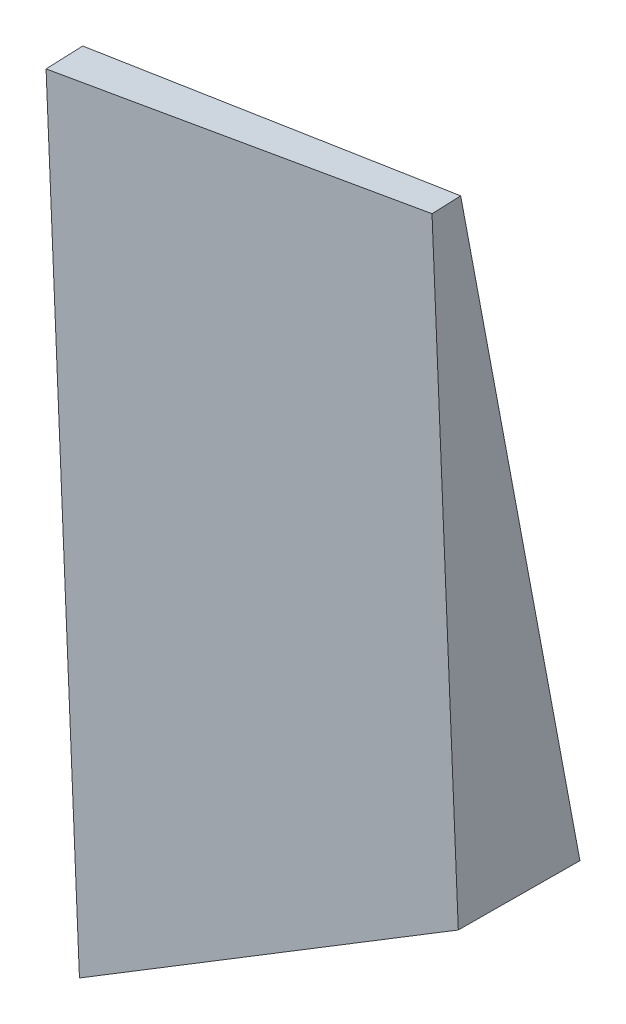
ISO-10303-21;
HEADER;
FILE_DESCRIPTION(('STEP AP214'),'2;1');
FILE_NAME('part.step','',(''),(''),'','','');
FILE_SCHEMA(('AUTOMOTIVE_DESIGN { 1 0 10303 214 1 1 1 1 }'));
ENDSEC;
DATA;
#1=APPLICATION_CONTEXT('core data for automotive mechanical design processes');
#2=APPLICATION_PROTOCOL_DEFINITION('international standard','automotive_design',2000,#1);
#3=PRODUCT_CONTEXT('',#1,'mechanical');
#4=PRODUCT('Part','Part','',(#3));
#5=PRODUCT_RELATED_PRODUCT_CATEGORY('part','',(#4));
#6=PRODUCT_DEFINITION_FORMATION('','',#4);
#7=PRODUCT_DEFINITION_CONTEXT('part definition',#1,'design');
#8=PRODUCT_DEFINITION('design','',#6,#7);
#9=PRODUCT_DEFINITION_SHAPE('','',#8);
#10=(LENGTH_UNIT() NAMED_UNIT(*) SI_UNIT(.MILLI.,.METRE.));
#11=(NAMED_UNIT(*) PLANE_ANGLE_UNIT() SI_UNIT($,.RADIAN.));
#12=(NAMED_UNIT(*) SI_UNIT($,.STERADIAN.) SOLID_ANGLE_UNIT());
#13=UNCERTAINTY_MEASURE_WITH_UNIT(LENGTH_MEASURE(1.E-05),#10,'distance_accuracy_value','');
#14=(GEOMETRIC_REPRESENTATION_CONTEXT(3) GLOBAL_UNCERTAINTY_ASSIGNED_CONTEXT((#13)) GLOBAL_UNIT_ASSIGNED_CONTEXT((#10,
#11,#12)) REPRESENTATION_CONTEXT('',''));
#15=CARTESIAN_POINT('',(0.,0.,0.));
#16=DIRECTION('',(0.,0.,1.));
#17=DIRECTION('',(1.,0.,0.));
#18=AXIS2_PLACEMENT_3D('',#15,#16,#17);
#19=CARTESIAN_POINT('',(-58.2869577274893,43.7119063771645,96.8635756928648));
#20=DIRECTION('',(-0.00567022710137501,0.18446689562685,-0.982822371002213));
#21=DIRECTION('',(0.,-0.982838170977841,-0.184469861139786));
#22=AXIS2_PLACEMENT_3D('',#19,#20,#21);
#23=PLANE('',#22);
#24=DIRECTION('',(-0.846048307736253,-0.524820913343644,-0.0936230201059844));
#25=VECTOR('',#24,1.);
#26=CARTESIAN_POINT('',(-58.2869577274893,43.7119063771645,96.8635756928648));
#27=LINE('',#26,#25);
#28=CARTESIAN_POINT('',(-63.0867699464945,40.7344855731488,96.332432362424));
#29=VERTEX_POINT('',#28);
#30=CARTESIAN_POINT('',(-64.2407216387582,40.0186659496703,96.2047370033077));
#31=VERTEX_POINT('',#30);
#32=EDGE_CURVE('E378',#29,#31,#27,.T.);
#33=ORIENTED_EDGE('',*,*,#32,.F.);
#34=DIRECTION('',(0.,-0.982838170977841,-0.184469861139786));
#35=VECTOR('',#34,1.);
#36=CARTESIAN_POINT('',(-63.0867699464945,-16.0792982410503,85.668997505591));
#37=LINE('',#36,#35);
#38=CARTESIAN_POINT('',(-63.0867699464945,58.26129742867,99.6220568852429));
#39=VERTEX_POINT('',#38);
#40=EDGE_CURVE('E204',#39,#29,#37,.T.);
#41=ORIENTED_EDGE('',*,*,#40,.F.);
#42=DIRECTION('',(-0.846048307736253,-0.524820913343644,-0.0936230201059844));
#43=VECTOR('',#42,1.);
#44=CARTESIAN_POINT('',(-62.2400443535721,58.7865384757421,99.7157548531787));
#45=LINE('',#44,#43);
#46=CARTESIAN_POINT('',(-62.9552754846525,58.3428661085344,99.6366079558287));
#47=VERTEX_POINT('',#46);
#48=EDGE_CURVE('E212',#47,#39,#45,.T.);
#49=ORIENTED_EDGE('',*,*,#48,.F.);
#50=DIRECTION('',(-0.999220589939013,-0.0394402136694499,-0.00163773857477176));
#51=VECTOR('',#50,1.);
#52=CARTESIAN_POINT('',(-2.56041087922055,60.7267104653858,99.7355961076726));
#53=LINE('',#52,#51);
#54=CARTESIAN_POINT('',(-64.2407216387582,58.2921282919913,99.6345010889631));
#55=VERTEX_POINT('',#54);
#56=EDGE_CURVE('E208',#47,#55,#53,.T.);
#57=ORIENTED_EDGE('',*,*,#56,.T.);
#58=DIRECTION('',(0.,-0.982838170977841,-0.184469861139786));
#59=VECTOR('',#58,1.);
#60=CARTESIAN_POINT('',(-64.2407216387582,-15.5565693333495,85.7737665361455));
#61=LINE('',#60,#59);
#62=EDGE_CURVE('E215',#55,#31,#61,.T.);
#63=ORIENTED_EDGE('',*,*,#62,.T.);
#64=EDGE_LOOP('',(#33,#41,#49,#57,#63));
#65=FACE_BOUND('',#64,.T.);
#66=DIRECTION('',(0.,-0.982838170977841,-0.184469861139786));
#67=VECTOR('',#66,1.);
#68=CARTESIAN_POINT('',(-65.0867699464945,-16.0813902466931,85.6801435160395));
#69=LINE('',#68,#67);
#70=CARTESIAN_POINT('',(-65.0867699464945,58.2587339380641,99.6331144022158));
#71=VERTEX_POINT('',#70);
#72=CARTESIAN_POINT('',(-65.0867699464945,39.4938450363267,96.1111139832017));
#73=VERTEX_POINT('',#72);
#74=EDGE_CURVE('E228',#71,#73,#69,.T.);
#75=ORIENTED_EDGE('',*,*,#74,.F.);
#76=CARTESIAN_POINT('',(-66.2407216387582,58.213186336498,99.6312230568824));
#77=VERTEX_POINT('',#76);
#78=EDGE_CURVE('E224',#71,#77,#53,.T.);
#79=ORIENTED_EDGE('',*,*,#78,.T.);
#80=DIRECTION('',(0.,-0.982838170977841,-0.184469861139786));
#81=VECTOR('',#80,1.);
#82=CARTESIAN_POINT('',(-66.2407216387582,-15.5586613389923,85.784912546594));
#83=LINE('',#82,#81);
#84=CARTESIAN_POINT('',(-66.2407216387582,38.7780254128483,95.9834186240854));
#85=VERTEX_POINT('',#84);
#86=EDGE_CURVE('E221',#77,#85,#83,.T.);
#87=ORIENTED_EDGE('',*,*,#86,.T.);
#88=EDGE_CURVE('E379',#73,#85,#27,.T.);
#89=ORIENTED_EDGE('',*,*,#88,.F.);
#90=EDGE_LOOP('',(#75,#79,#87,#89));
#91=FACE_BOUND('',#90,.T.);
#92=CARTESIAN_POINT('',(-61.0867699464945,41.9751261099708,96.5537507416463));
#93=VERTEX_POINT('',#92);
#94=CARTESIAN_POINT('',(-62.2407216387582,41.2593064864924,96.42605538253));
#95=VERTEX_POINT('',#94);
#96=EDGE_CURVE('E200',#93,#95,#27,.T.);
#97=ORIENTED_EDGE('',*,*,#96,.F.);
#98=DIRECTION('',(0.,-0.982838170977841,-0.184469861139786));
#99=VECTOR('',#98,1.);
#100=CARTESIAN_POINT('',(-61.0867699464945,-16.0772062354074,85.6578514951426));
#101=LINE('',#100,#99);
#102=CARTESIAN_POINT('',(-61.0867699464945,58.2617728613787,99.6106074586335));
#103=VERTEX_POINT('',#102);
#104=EDGE_CURVE('E188',#103,#93,#101,.T.);
#105=ORIENTED_EDGE('',*,*,#104,.F.);
#106=DIRECTION('',(-0.846048307736253,-0.524820913343644,-0.0936230201059845));
#107=VECTOR('',#106,1.);
#108=CARTESIAN_POINT('',(-60.2393485525558,58.787445527924,99.7043824233459));
#109=LINE('',#108,#107);
#110=CARTESIAN_POINT('',(-60.8201861868853,58.4271401706935,99.6401074014353));
#111=VERTEX_POINT('',#110);
#112=EDGE_CURVE('E11',#111,#103,#109,.T.);
#113=ORIENTED_EDGE('',*,*,#112,.F.);
#114=CARTESIAN_POINT('',(-62.2407216387582,58.3710702474846,99.6377791210438));
#115=VERTEX_POINT('',#114);
#116=EDGE_CURVE('E202',#111,#115,#53,.T.);
#117=ORIENTED_EDGE('',*,*,#116,.T.);
#118=DIRECTION('',(0.,-0.982838170977841,-0.184469861139786));
#119=VECTOR('',#118,1.);
#120=CARTESIAN_POINT('',(-62.2407216387582,-15.5544773277066,85.762620525697));
#121=LINE('',#120,#119);
#122=EDGE_CURVE('E201',#115,#95,#121,.T.);
#123=ORIENTED_EDGE('',*,*,#122,.T.);
#124=EDGE_LOOP('',(#97,#105,#113,#117,#123));
#125=FACE_BOUND('',#124,.T.);
#126=CARTESIAN_POINT('',(-58.6448652253226,43.4898891020423,96.8239699391989));
#127=VERTEX_POINT('',#126);
#128=CARTESIAN_POINT('',(-60.2407216387582,42.4999470233144,96.6473737617523));
#129=VERTEX_POINT('',#128);
#130=EDGE_CURVE('E275',#127,#129,#27,.T.);
#131=ORIENTED_EDGE('',*,*,#130,.F.);
#132=DIRECTION('',(-0.148514207820213,0.971783066296917,0.183251745241612));
#133=VECTOR('',#132,1.);
#134=CARTESIAN_POINT('',(-61.0455548515273,59.1984839928735,99.7861819069455));
#135=LINE('',#134,#133);
#136=CARTESIAN_POINT('',(-59.1863421702249,47.0329718386543,97.4920985756575));
#137=VERTEX_POINT('',#136);
#138=EDGE_CURVE('E243',#127,#137,#135,.T.);
#139=ORIENTED_EDGE('',*,*,#138,.T.);
#140=DIRECTION('',(0.,-0.982838170977841,-0.184469861139786));
#141=VECTOR('',#140,1.);
#142=CARTESIAN_POINT('',(-59.186342170225,-16.587935015544,85.5510281130565));
#143=LINE('',#142,#141);
#144=CARTESIAN_POINT('',(-59.1863421702249,58.4916295915168,99.6427852979861));
#145=VERTEX_POINT('',#144);
#146=EDGE_CURVE('E240',#145,#137,#143,.T.);
#147=ORIENTED_EDGE('',*,*,#146,.F.);
#148=CARTESIAN_POINT('',(-60.2407216387582,58.4500122029779,99.6410571531246));
#149=VERTEX_POINT('',#148);
#150=EDGE_CURVE('E207',#145,#149,#53,.T.);
#151=ORIENTED_EDGE('',*,*,#150,.T.);
#152=DIRECTION('',(0.,-0.982838170977841,-0.184469861139786));
#153=VECTOR('',#152,1.);
#154=CARTESIAN_POINT('',(-60.2407216387582,-15.5523853220638,85.7514745152485));
#155=LINE('',#154,#153);
#156=EDGE_CURVE('E237',#149,#129,#155,.T.);
#157=ORIENTED_EDGE('',*,*,#156,.T.);
#158=EDGE_LOOP('',(#131,#139,#147,#151,#157));
#159=FACE_BOUND('',#158,.T.);
#160=CARTESIAN_POINT('',(-67.0867699464945,38.2532044995047,95.8897956039794));
#161=VERTEX_POINT('',#160);
#162=CARTESIAN_POINT('',(-68.0867699464945,37.6328842310936,95.7791364143682));
#163=VERTEX_POINT('',#162);
#164=EDGE_CURVE('E279',#161,#163,#27,.T.);
#165=ORIENTED_EDGE('',*,*,#164,.F.);
#166=DIRECTION('',(0.,-0.982838170977841,-0.184469861139786));
#167=VECTOR('',#166,1.);
#168=CARTESIAN_POINT('',(-67.0867699464945,-16.083482252336,85.691289526488));
#169=LINE('',#168,#167);
#170=CARTESIAN_POINT('',(-67.0867699464945,58.179791982571,99.6298363701351));
#171=VERTEX_POINT('',#170);
#172=EDGE_CURVE('E218',#171,#161,#169,.T.);
#173=ORIENTED_EDGE('',*,*,#172,.F.);
#174=DIRECTION('',(-0.999220589939013,-0.0394402136694499,-0.00163773857477176));
#175=VECTOR('',#174,1.);
#176=CARTESIAN_POINT('',(-2.56041087922055,60.7267104653858,99.7355961076726));
#177=LINE('',#176,#175);
#178=CARTESIAN_POINT('',(-68.0867699464945,58.1403210048242,99.6281973540947));
#179=VERTEX_POINT('',#178);
#180=EDGE_CURVE('E225',#171,#179,#177,.T.);
#181=ORIENTED_EDGE('',*,*,#180,.T.);
#182=DIRECTION('',(0.,0.982838170977841,0.184469861139786));
#183=VECTOR('',#182,1.);
#184=CARTESIAN_POINT('',(-68.0867699464945,-15.5718116222048,85.7930948198728));
#185=LINE('',#184,#183);
#186=EDGE_CURVE('E231',#163,#179,#185,.T.);
#187=ORIENTED_EDGE('',*,*,#186,.F.);
#188=EDGE_LOOP('',(#165,#173,#181,#187));
#189=FACE_BOUND('',#188,.T.);
#190=DIRECTION('',(-0.98373291956192,-0.177498198210662,-0.0276393307109655));
#191=VECTOR('',#190,1.);
#192=CARTESIAN_POINT('',(-58.3409032958374,60.0185879382184,99.9245039927561));
#193=LINE('',#192,#191);
#194=CARTESIAN_POINT('',(-58.3365560583597,60.0193723247161,99.924626134378));
#195=VERTEX_POINT('',#194);
#196=CARTESIAN_POINT('',(-68.9365560583597,58.1067791161134,99.6268045410265));
#197=VERTEX_POINT('',#196);
#198=EDGE_CURVE('E234',#195,#197,#193,.T.);
#199=ORIENTED_EDGE('',*,*,#198,.F.);
#200=DIRECTION('',(0.,0.982838170977841,0.184469861139786));
#201=VECTOR('',#200,1.);
#202=CARTESIAN_POINT('',(-58.3365560583597,43.7118544971705,96.8638521046219));
#203=LINE('',#202,#201);
#204=CARTESIAN_POINT('',(-58.3365560583597,42.6983013562684,96.6736173206249));
#205=VERTEX_POINT('',#204);
#206=EDGE_CURVE('E263',#205,#195,#203,.T.);
#207=ORIENTED_EDGE('',*,*,#206,.F.);
#208=DIRECTION('',(-0.846048307736253,-0.524820913343644,-0.0936230201059844));
#209=VECTOR('',#208,1.);
#210=CARTESIAN_POINT('',(-58.2869577274893,42.7290682061867,96.6791058317251));
#211=LINE('',#210,#209);
#212=CARTESIAN_POINT('',(-68.9365560583597,36.1229065111116,95.5006299107466));
#213=VERTEX_POINT('',#212);
#214=EDGE_CURVE('E274',#205,#213,#211,.T.);
#215=ORIENTED_EDGE('',*,*,#214,.T.);
#216=DIRECTION('',(0.,0.982838170977841,0.184469861139786));
#217=VECTOR('',#216,1.);
#218=CARTESIAN_POINT('',(-68.9365560583597,58.1067791161134,99.6268045410265));
#219=LINE('',#218,#217);
#220=EDGE_CURVE('E294',#213,#197,#219,.T.);
#221=ORIENTED_EDGE('',*,*,#220,.T.);
#222=EDGE_LOOP('',(#199,#207,#215,#221));
#223=FACE_BOUND('',#222,.T.);
#224=ADVANCED_FACE('F36',(#65,#91,#125,#159,#189,#223),#23,.T.);
#225=CARTESIAN_POINT('',(-64.2407216387582,0.524820913343643,0.0936230201059874));
#226=DIRECTION('',(1.,0.,0.));
#227=DIRECTION('',(0.,0.,-1.));
#228=AXIS2_PLACEMENT_3D('',#225,#226,#227);
#229=PLANE('',#228);
#230=DIRECTION('',(0.,0.999138967689794,0.0414888327598325));
#231=VECTOR('',#230,1.);
#232=CARTESIAN_POINT('',(-64.2407216387582,-4.02982029167944,97.0466079272807));
#233=LINE('',#232,#231);
#234=CARTESIAN_POINT('',(-64.2407216387582,40.0359091496444,98.8764191330816));
#235=VERTEX_POINT('',#234);
#236=EDGE_CURVE('E257',#235,#55,#233,.T.);
#237=ORIENTED_EDGE('',*,*,#236,.F.);
#238=DIRECTION('',(0.,0.00645392678311588,0.999979173197661));
#239=VECTOR('',#238,1.);
#240=CARTESIAN_POINT('',(-64.2407216387582,39.3973451163643,-0.0634597176755666));
#241=LINE('',#240,#239);
#242=EDGE_CURVE('E322',#31,#235,#241,.T.);
#243=ORIENTED_EDGE('',*,*,#242,.F.);
#244=ORIENTED_EDGE('',*,*,#62,.F.);
#245=EDGE_LOOP('',(#237,#243,#244));
#246=FACE_BOUND('',#245,.T.);
#247=ADVANCED_FACE('F375',(#246),#229,.T.);
#248=CARTESIAN_POINT('',(-65.0867699464945,0.,0.));
#249=DIRECTION('',(1.,0.,0.));
#250=DIRECTION('',(0.,0.,-1.));
#251=AXIS2_PLACEMENT_3D('',#248,#249,#250);
#252=PLANE('',#251);
#253=ORIENTED_EDGE('',*,*,#74,.T.);
#254=DIRECTION('',(0.,0.00645392678311588,0.999979173197661));
#255=VECTOR('',#254,1.);
#256=CARTESIAN_POINT('',(-65.0867699464945,38.8731502870086,-0.0600765321658807));
#257=LINE('',#256,#255);
#258=CARTESIAN_POINT('',(-65.0867699464945,39.5115519561081,98.8546454172998));
#259=VERTEX_POINT('',#258);
#260=EDGE_CURVE('E319',#73,#259,#257,.T.);
#261=ORIENTED_EDGE('',*,*,#260,.T.);
#262=DIRECTION('',(0.,0.999138967689794,0.0414888327598311));
#263=VECTOR('',#262,1.);
#264=CARTESIAN_POINT('',(-65.0867699464945,37.652235453463,98.7774380678515));
#265=LINE('',#264,#263);
#266=EDGE_CURVE('E255',#259,#71,#265,.T.);
#267=ORIENTED_EDGE('',*,*,#266,.T.);
#268=EDGE_LOOP('',(#253,#261,#267));
#269=FACE_BOUND('',#268,.T.);
#270=ADVANCED_FACE('F411',(#269),#252,.F.);
#271=CARTESIAN_POINT('',(-62.2407216387582,0.524820913343644,0.0936230201059876));
#272=DIRECTION('',(1.,0.,0.));
#273=DIRECTION('',(0.,0.,-1.));
#274=AXIS2_PLACEMENT_3D('',#271,#272,#273);
#275=PLANE('',#274);
#276=DIRECTION('',(0.,0.999138967689794,0.0414888327598325));
#277=VECTOR('',#276,1.);
#278=CARTESIAN_POINT('',(-62.2407216387582,-4.02982029167944,97.0466079272807));
#279=LINE('',#278,#277);
#280=CARTESIAN_POINT('',(-62.2407216387582,41.2754534847411,98.9278906993805));
#281=VERTEX_POINT('',#280);
#282=EDGE_CURVE('E253',#281,#115,#279,.T.);
#283=ORIENTED_EDGE('',*,*,#282,.F.);
#284=DIRECTION('',(0.,0.00645392678311588,0.999979173197661));
#285=VECTOR('',#284,1.);
#286=CARTESIAN_POINT('',(-62.2407216387582,40.6365056337072,-0.0714573354918311));
#287=LINE('',#286,#285);
#288=EDGE_CURVE('E328',#95,#281,#287,.T.);
#289=ORIENTED_EDGE('',*,*,#288,.F.);
#290=ORIENTED_EDGE('',*,*,#122,.F.);
#291=EDGE_LOOP('',(#283,#289,#290));
#292=FACE_BOUND('',#291,.T.);
#293=ADVANCED_FACE('F408',(#292),#275,.T.);
#294=CARTESIAN_POINT('',(-63.0867699464945,0.,0.));
#295=DIRECTION('',(1.,0.,0.));
#296=DIRECTION('',(0.,0.,-1.));
#297=AXIS2_PLACEMENT_3D('',#294,#295,#296);
#298=PLANE('',#297);
#299=ORIENTED_EDGE('',*,*,#40,.T.);
#300=DIRECTION('',(0.,0.00645392678311588,0.999979173197661));
#301=VECTOR('',#300,1.);
#302=CARTESIAN_POINT('',(-63.0867699464945,40.1123108043515,-0.0680741499821451));
#303=LINE('',#302,#301);
#304=CARTESIAN_POINT('',(-63.0867699464945,40.7510962912048,98.9061169835986));
#305=VERTEX_POINT('',#304);
#306=EDGE_CURVE('E325',#29,#305,#303,.T.);
#307=ORIENTED_EDGE('',*,*,#306,.T.);
#308=DIRECTION('',(0.,0.999138967689794,0.0414888327598311));
#309=VECTOR('',#308,1.);
#310=CARTESIAN_POINT('',(-63.0867699464945,37.652235453463,98.7774380678515));
#311=LINE('',#310,#309);
#312=CARTESIAN_POINT('',(-63.0867699464945,58.2608346476118,99.6332016333117));
#313=VERTEX_POINT('',#312);
#314=EDGE_CURVE('E248',#305,#313,#311,.T.);
#315=ORIENTED_EDGE('',*,*,#314,.T.);
#316=DIRECTION('',(0.,0.0414888327597779,-0.999138967689796));
#317=VECTOR('',#316,1.);
#318=CARTESIAN_POINT('',(-63.0867699464945,58.2608346476118,99.6332016333117));
#319=LINE('',#318,#317);
#320=EDGE_CURVE('E251',#313,#39,#319,.T.);
#321=ORIENTED_EDGE('',*,*,#320,.T.);
#322=EDGE_LOOP('',(#299,#307,#315,#321));
#323=FACE_BOUND('',#322,.T.);
#324=ADVANCED_FACE('F410',(#323),#298,.F.);
#325=CARTESIAN_POINT('',(-60.2407216387582,0.524820913343644,0.0936230201059828));
#326=DIRECTION('',(1.,0.,0.));
#327=DIRECTION('',(0.,0.,-1.));
#328=AXIS2_PLACEMENT_3D('',#325,#326,#327);
#329=PLANE('',#328);
#330=DIRECTION('',(0.,0.999138967689794,0.0414888327598325));
#331=VECTOR('',#330,1.);
#332=CARTESIAN_POINT('',(-60.2407216387582,-4.02982029167944,97.0466079272807));
#333=LINE('',#332,#331);
#334=CARTESIAN_POINT('',(-60.2407216387582,42.5149978198378,98.9793622656793));
#335=VERTEX_POINT('',#334);
#336=EDGE_CURVE('E191',#335,#149,#333,.T.);
#337=ORIENTED_EDGE('',*,*,#336,.F.);
#338=DIRECTION('',(0.,0.00645392678311588,0.999979173197661));
#339=VECTOR('',#338,1.);
#340=CARTESIAN_POINT('',(-60.2407216387582,41.8756661510501,-0.0794549533080955));
#341=LINE('',#340,#339);
#342=EDGE_CURVE('E334',#129,#335,#341,.T.);
#343=ORIENTED_EDGE('',*,*,#342,.F.);
#344=ORIENTED_EDGE('',*,*,#156,.F.);
#345=EDGE_LOOP('',(#337,#343,#344));
#346=FACE_BOUND('',#345,.T.);
#347=ADVANCED_FACE('F344',(#346),#329,.T.);
#348=CARTESIAN_POINT('',(-61.0867699464945,0.,0.));
#349=DIRECTION('',(1.,0.,0.));
#350=DIRECTION('',(0.,0.,-1.));
#351=AXIS2_PLACEMENT_3D('',#348,#349,#350);
#352=PLANE('',#351);
#353=ORIENTED_EDGE('',*,*,#104,.T.);
#354=DIRECTION('',(0.,0.00645392678311588,0.999979173197661));
#355=VECTOR('',#354,1.);
#356=CARTESIAN_POINT('',(-61.0867699464945,41.3514713216943,-0.0760717677984095));
#357=LINE('',#356,#355);
#358=CARTESIAN_POINT('',(-61.0867699464945,41.9906406263015,98.9575885498975));
#359=VERTEX_POINT('',#358);
#360=EDGE_CURVE('E332',#93,#359,#357,.T.);
#361=ORIENTED_EDGE('',*,*,#360,.T.);
#362=DIRECTION('',(0.,0.999138967689794,0.0414888327598311));
#363=VECTOR('',#362,1.);
#364=CARTESIAN_POINT('',(-61.0867699464945,37.652235453463,98.7774380678515));
#365=LINE('',#364,#363);
#366=CARTESIAN_POINT('',(-61.0867699464945,58.2608346476118,99.6332016333117));
#367=VERTEX_POINT('',#366);
#368=EDGE_CURVE('E190',#359,#367,#365,.T.);
#369=ORIENTED_EDGE('',*,*,#368,.T.);
#370=DIRECTION('',(0.,0.0414888327597779,-0.999138967689796));
#371=VECTOR('',#370,1.);
#372=CARTESIAN_POINT('',(-61.0867699464945,58.2608346476118,99.6332016333117));
#373=LINE('',#372,#371);
#374=EDGE_CURVE('E184',#367,#103,#373,.T.);
#375=ORIENTED_EDGE('',*,*,#374,.T.);
#376=EDGE_LOOP('',(#353,#361,#369,#375));
#377=FACE_BOUND('',#376,.T.);
#378=ADVANCED_FACE('F185',(#377),#352,.F.);
#379=CARTESIAN_POINT('',(0.,-4.02982029167944,97.0466079272807));
#380=DIRECTION('',(0.,0.0414888327598325,-0.999138967689794));
#381=DIRECTION('',(0.,-0.999138967689794,-0.0414888327598325));
#382=AXIS2_PLACEMENT_3D('',#379,#380,#381);
#383=PLANE('',#382);
#384=DIRECTION('',(0.,0.999138967689794,0.0414888327598311));
#385=VECTOR('',#384,1.);
#386=CARTESIAN_POINT('',(-67.0867699464945,37.652235453463,98.7774380678515));
#387=LINE('',#386,#385);
#388=CARTESIAN_POINT('',(-67.0867699464945,38.2720076210113,98.8031738510009));
#389=VERTEX_POINT('',#388);
#390=EDGE_CURVE('E259',#389,#171,#387,.T.);
#391=ORIENTED_EDGE('',*,*,#390,.F.);
#392=DIRECTION('',(-0.849786111865225,-0.526673780503201,-0.0218699110983625));
#393=VECTOR('',#392,1.);
#394=CARTESIAN_POINT('',(-37.6062231472867,56.5432300112671,99.561878810552));
#395=LINE('',#394,#393);
#396=CARTESIAN_POINT('',(-68.0867699464945,37.652235453463,98.7774380678515));
#397=VERTEX_POINT('',#396);
#398=EDGE_CURVE('E284',#389,#397,#395,.T.);
#399=ORIENTED_EDGE('',*,*,#398,.T.);
#400=DIRECTION('',(0.,-0.999138967689794,-0.041488832759833));
#401=VECTOR('',#400,1.);
#402=CARTESIAN_POINT('',(-68.0867699464945,36.6703247079947,98.7366646299002));
#403=LINE('',#402,#401);
#404=EDGE_CURVE('E295',#179,#397,#403,.T.);
#405=ORIENTED_EDGE('',*,*,#404,.F.);
#406=ORIENTED_EDGE('',*,*,#180,.F.);
#407=EDGE_LOOP('',(#391,#399,#405,#406));
#408=FACE_BOUND('',#407,.T.);
#409=ADVANCED_FACE('F397',(#408),#383,.T.);
#410=CARTESIAN_POINT('',(-58.3365560583597,60.0284257647011,99.7066001240284));
#411=DIRECTION('',(0.17852870265575,-0.983087504729544,-0.0408223023933432));
#412=DIRECTION('',(-0.983907668134138,-0.178677644339866,0.));
#413=AXIS2_PLACEMENT_3D('',#410,#411,#412);
#414=PLANE('',#413);
#415=DIRECTION('',(0.,-0.041488832759833,0.999138967689794));
#416=VECTOR('',#415,1.);
#417=CARTESIAN_POINT('',(-68.9365560583597,58.1067791161134,99.6268045410265));
#418=LINE('',#417,#416);
#419=CARTESIAN_POINT('',(-68.9365560583597,58.0652902833536,100.625943508716));
#420=VERTEX_POINT('',#419);
#421=EDGE_CURVE('E309',#197,#420,#418,.T.);
#422=ORIENTED_EDGE('',*,*,#421,.T.);
#423=DIRECTION('',(-0.983934704301081,-0.178374983674464,-0.00740694748731362));
#424=VECTOR('',#423,1.);
#425=CARTESIAN_POINT('',(-58.3365560583597,59.9869369319413,100.705739091718));
#426=LINE('',#425,#424);
#427=CARTESIAN_POINT('',(-58.3365560583597,59.9869369319413,100.705739091718));
#428=VERTEX_POINT('',#427);
#429=EDGE_CURVE('E304',#428,#420,#426,.T.);
#430=ORIENTED_EDGE('',*,*,#429,.F.);
#431=DIRECTION('',(0.,-0.041488832759833,0.999138967689794));
#432=VECTOR('',#431,1.);
#433=CARTESIAN_POINT('',(-58.3365560583597,60.0284257647011,99.7066001240284));
#434=LINE('',#433,#432);
#435=EDGE_CURVE('E299',#195,#428,#434,.T.);
#436=ORIENTED_EDGE('',*,*,#435,.F.);
#437=ORIENTED_EDGE('',*,*,#198,.T.);
#438=EDGE_LOOP('',(#422,#430,#436,#437));
#439=FACE_BOUND('',#438,.T.);
#440=ADVANCED_FACE('F442',(#439),#414,.F.);
#441=CARTESIAN_POINT('',(-68.0867699464945,36.6495802916148,95.522499821845));
#442=DIRECTION('',(0.526689837508027,-0.850039832346384,0.00548620910088931));
#443=DIRECTION('',(-0.850052625092991,-0.526697763971441,0.));
#444=AXIS2_PLACEMENT_3D('',#441,#442,#443);
#445=PLANE('',#444);
#446=ORIENTED_EDGE('',*,*,#214,.F.);
#447=DIRECTION('',(0.,-0.00645392678311711,-0.999979173197661));
#448=VECTOR('',#447,1.);
#449=CARTESIAN_POINT('',(-58.3365560583597,42.7132359035041,98.9875940201858));
#450=LINE('',#449,#448);
#451=CARTESIAN_POINT('',(-58.3365560583597,42.7196972583064,99.9887240995997));
#452=VERTEX_POINT('',#451);
#453=EDGE_CURVE('E266',#452,#205,#450,.T.);
#454=ORIENTED_EDGE('',*,*,#453,.F.);
#455=DIRECTION('',(0.849786111865225,0.5266737805032,0.0218699110983625));
#456=VECTOR('',#455,1.);
#457=CARTESIAN_POINT('',(-37.1874989403617,55.827294229932,100.533011647403));
#458=LINE('',#457,#456);
#459=CARTESIAN_POINT('',(-68.9365560583597,36.1501122822938,99.7159247982157));
#460=VERTEX_POINT('',#459);
#461=EDGE_CURVE('E268',#460,#452,#458,.T.);
#462=ORIENTED_EDGE('',*,*,#461,.F.);
#463=DIRECTION('',(0.,0.00645392678311705,0.999979173197661));
#464=VECTOR('',#463,1.);
#465=CARTESIAN_POINT('',(-68.9365560583597,36.1504516834546,99.7685120220167));
#466=LINE('',#465,#464);
#467=EDGE_CURVE('E271',#213,#460,#466,.T.);
#468=ORIENTED_EDGE('',*,*,#467,.F.);
#469=EDGE_LOOP('',(#446,#454,#462,#468));
#470=FACE_BOUND('',#469,.T.);
#471=ADVANCED_FACE('F439',(#470),#445,.T.);
#472=CARTESIAN_POINT('',(-68.0867699464945,0.5266737805032,0.0218699110983634));
#473=DIRECTION('',(-1.,0.,0.));
#474=DIRECTION('',(0.,0.,1.));
#475=AXIS2_PLACEMENT_3D('',#472,#473,#474);
#476=PLANE('',#475);
#477=ORIENTED_EDGE('',*,*,#186,.T.);
#478=ORIENTED_EDGE('',*,*,#404,.T.);
#479=DIRECTION('',(0.,0.00645392678311588,0.999979173197661));
#480=VECTOR('',#479,1.);
#481=CARTESIAN_POINT('',(-68.0867699464945,37.0133411239842,-0.213617272941404));
#482=LINE('',#481,#480);
#483=EDGE_CURVE('E287',#163,#397,#482,.T.);
#484=ORIENTED_EDGE('',*,*,#483,.F.);
#485=EDGE_LOOP('',(#477,#478,#484));
#486=FACE_BOUND('',#485,.T.);
#487=ADVANCED_FACE('F393',(#486),#476,.F.);
#488=CARTESIAN_POINT('',(-58.3365560583597,42.7132359035041,98.9875940201858));
#489=DIRECTION('',(-1.,0.,0.));
#490=DIRECTION('',(0.,1.,0.));
#491=AXIS2_PLACEMENT_3D('',#488,#489,#490);
#492=PLANE('',#491);
#493=ORIENTED_EDGE('',*,*,#435,.T.);
#494=DIRECTION('',(0.,0.999138967689794,0.0414888327598325));
#495=VECTOR('',#494,1.);
#496=CARTESIAN_POINT('',(-58.3365560583597,42.6717470707443,99.9867329878756));
#497=LINE('',#496,#495);
#498=EDGE_CURVE('E302',#452,#428,#497,.T.);
#499=ORIENTED_EDGE('',*,*,#498,.F.);
#500=ORIENTED_EDGE('',*,*,#453,.T.);
#501=ORIENTED_EDGE('',*,*,#206,.T.);
#502=EDGE_LOOP('',(#493,#499,#500,#501));
#503=FACE_BOUND('',#502,.T.);
#504=ADVANCED_FACE('F38',(#503),#492,.F.);
#505=DIRECTION('',(0.,0.999138967689794,0.0414888327598325));
#506=VECTOR('',#505,1.);
#507=CARTESIAN_POINT('',(-59.1863421702249,42.1865621230009,98.9657241090874));
#508=LINE('',#507,#506);
#509=CARTESIAN_POINT('',(-59.1863421702249,43.1684728684692,99.0064975470387));
#510=VERTEX_POINT('',#509);
#511=EDGE_CURVE('E289',#510,#145,#508,.T.);
#512=ORIENTED_EDGE('',*,*,#511,.F.);
#513=EDGE_CURVE('E285',#510,#335,#395,.T.);
#514=ORIENTED_EDGE('',*,*,#513,.T.);
#515=ORIENTED_EDGE('',*,*,#336,.T.);
#516=ORIENTED_EDGE('',*,*,#150,.F.);
#517=EDGE_LOOP('',(#512,#514,#515,#516));
#518=FACE_BOUND('',#517,.T.);
#519=ADVANCED_FACE('F348',(#518),#383,.T.);
#520=DIRECTION('',(0.84823562074489,0.529163024826928,0.0219732759402766));
#521=VECTOR('',#520,1.);
#522=CARTESIAN_POINT('',(-45.1422925174254,68.207632093163,100.04623828693));
#523=LINE('',#522,#521);
#524=EDGE_CURVE('E44',#367,#111,#523,.T.);
#525=ORIENTED_EDGE('',*,*,#524,.F.);
#526=ORIENTED_EDGE('',*,*,#368,.F.);
#527=EDGE_CURVE('E57',#359,#281,#395,.T.);
#528=ORIENTED_EDGE('',*,*,#527,.T.);
#529=ORIENTED_EDGE('',*,*,#282,.T.);
#530=ORIENTED_EDGE('',*,*,#116,.F.);
#531=EDGE_LOOP('',(#525,#526,#528,#529,#530));
#532=FACE_BOUND('',#531,.T.);
#533=ADVANCED_FACE('F403',(#532),#383,.T.);
#534=DIRECTION('',(0.84823562074489,0.529163024826927,0.0219732759402766));
#535=VECTOR('',#534,1.);
#536=CARTESIAN_POINT('',(-45.7032851808244,69.1053419468417,100.083515317644));
#537=LINE('',#536,#535);
#538=EDGE_CURVE('E330',#313,#47,#537,.T.);
#539=ORIENTED_EDGE('',*,*,#538,.F.);
#540=ORIENTED_EDGE('',*,*,#314,.F.);
#541=EDGE_CURVE('E373',#305,#235,#395,.T.);
#542=ORIENTED_EDGE('',*,*,#541,.T.);
#543=ORIENTED_EDGE('',*,*,#236,.T.);
#544=ORIENTED_EDGE('',*,*,#56,.F.);
#545=EDGE_LOOP('',(#539,#540,#542,#543,#544));
#546=FACE_BOUND('',#545,.T.);
#547=ADVANCED_FACE('F369',(#546),#383,.T.);
#548=ORIENTED_EDGE('',*,*,#266,.F.);
#549=CARTESIAN_POINT('',(-66.2407216387582,38.7963648145477,98.8249475667828));
#550=VERTEX_POINT('',#549);
#551=EDGE_CURVE('E398',#259,#550,#395,.T.);
#552=ORIENTED_EDGE('',*,*,#551,.T.);
#553=DIRECTION('',(0.,0.999138967689794,0.0414888327598325));
#554=VECTOR('',#553,1.);
#555=CARTESIAN_POINT('',(-66.2407216387582,-4.02982029167944,97.0466079272807));
#556=LINE('',#555,#554);
#557=EDGE_CURVE('E261',#550,#77,#556,.T.);
#558=ORIENTED_EDGE('',*,*,#557,.T.);
#559=ORIENTED_EDGE('',*,*,#78,.F.);
#560=EDGE_LOOP('',(#548,#552,#558,#559));
#561=FACE_BOUND('',#560,.T.);
#562=ADVANCED_FACE('F436',(#561),#383,.T.);
#563=CARTESIAN_POINT('',(-59.1863421702249,59.5017519841979,99.68473021293));
#564=DIRECTION('',(-0.0817186689593491,0.172613042491652,-0.981594008083427));
#565=DIRECTION('',(0.,-0.984888028616499,-0.173192295117036));
#566=AXIS2_PLACEMENT_3D('',#563,#564,#565);
#567=PLANE('',#566);
#568=DIRECTION('',(-0.849786111865225,-0.526673780503201,-0.0218699110983639));
#569=VECTOR('',#568,1.);
#570=CARTESIAN_POINT('',(-51.8164485725538,47.7219516918521,96.9997045894285));
#571=LINE('',#570,#569);
#572=CARTESIAN_POINT('',(-59.1863421702249,43.1542967622227,96.8100346059644));
#573=VERTEX_POINT('',#572);
#574=EDGE_CURVE('E278',#127,#573,#571,.T.);
#575=ORIENTED_EDGE('',*,*,#574,.T.);
#576=DIRECTION('',(0.,-0.984888028616499,-0.173192295117036));
#577=VECTOR('',#576,1.);
#578=CARTESIAN_POINT('',(-59.1863421702249,59.5017519841979,99.68473021293));
#579=LINE('',#578,#577);
#580=EDGE_CURVE('E291',#137,#573,#579,.T.);
#581=ORIENTED_EDGE('',*,*,#580,.F.);
#582=ORIENTED_EDGE('',*,*,#138,.F.);
#583=EDGE_LOOP('',(#575,#581,#582));
#584=FACE_BOUND('',#583,.T.);
#585=ADVANCED_FACE('F354',(#584),#567,.T.);
#586=CARTESIAN_POINT('',(-59.186342170225,-0.526673780503084,-0.021869911098359));
#587=DIRECTION('',(1.,0.,0.));
#588=DIRECTION('',(0.,-1.,0.));
#589=AXIS2_PLACEMENT_3D('',#586,#587,#588);
#590=PLANE('',#589);
#591=ORIENTED_EDGE('',*,*,#146,.T.);
#592=ORIENTED_EDGE('',*,*,#580,.T.);
#593=DIRECTION('',(0.,-0.00645392678311594,-0.999979173197661));
#594=VECTOR('',#593,1.);
#595=CARTESIAN_POINT('',(-59.1863421702249,42.5275443048951,-0.299744469564329));
#596=LINE('',#595,#594);
#597=EDGE_CURVE('E298',#510,#573,#596,.T.);
#598=ORIENTED_EDGE('',*,*,#597,.F.);
#599=ORIENTED_EDGE('',*,*,#511,.T.);
#600=EDGE_LOOP('',(#591,#592,#598,#599));
#601=FACE_BOUND('',#600,.T.);
#602=ADVANCED_FACE('F351',(#601),#590,.F.);
#603=CARTESIAN_POINT('',(-66.2407216387582,0.524820913343644,0.093623020105986));
#604=DIRECTION('',(1.,0.,0.));
#605=DIRECTION('',(0.,0.,-1.));
#606=AXIS2_PLACEMENT_3D('',#603,#604,#605);
#607=PLANE('',#606);
#608=ORIENTED_EDGE('',*,*,#557,.F.);
#609=DIRECTION('',(0.,0.00645392678311588,0.999979173197661));
#610=VECTOR('',#609,1.);
#611=CARTESIAN_POINT('',(-66.2407216387582,38.1581845990215,-0.0554620998593022));
#612=LINE('',#611,#610);
#613=EDGE_CURVE('E317',#85,#550,#612,.T.);
#614=ORIENTED_EDGE('',*,*,#613,.F.);
#615=ORIENTED_EDGE('',*,*,#86,.F.);
#616=EDGE_LOOP('',(#608,#614,#615));
#617=FACE_BOUND('',#616,.T.);
#618=ADVANCED_FACE('F433',(#617),#607,.T.);
#619=CARTESIAN_POINT('',(-67.0867699464945,0.,0.));
#620=DIRECTION('',(1.,0.,0.));
#621=DIRECTION('',(0.,0.,-1.));
#622=AXIS2_PLACEMENT_3D('',#619,#620,#621);
#623=PLANE('',#622);
#624=ORIENTED_EDGE('',*,*,#172,.T.);
#625=DIRECTION('',(0.,0.00645392678311588,0.999979173197661));
#626=VECTOR('',#625,1.);
#627=CARTESIAN_POINT('',(-67.0867699464945,37.6339897696657,-0.0520789143496163));
#628=LINE('',#627,#626);
#629=EDGE_CURVE('E315',#161,#389,#628,.T.);
#630=ORIENTED_EDGE('',*,*,#629,.T.);
#631=ORIENTED_EDGE('',*,*,#390,.T.);
#632=EDGE_LOOP('',(#624,#630,#631));
#633=FACE_BOUND('',#632,.T.);
#634=ADVANCED_FACE('F485',(#633),#623,.F.);
#635=CARTESIAN_POINT('',(-62.2407216387582,58.7856555609554,99.7268246534177));
#636=DIRECTION('',(0.529619043935857,-0.847505262468763,-0.0351923058099712));
#637=DIRECTION('',(-0.848030567411937,-0.52994731505593,0.));
#638=AXIS2_PLACEMENT_3D('',#635,#636,#637);
#639=PLANE('',#638);
#640=ORIENTED_EDGE('',*,*,#48,.T.);
#641=ORIENTED_EDGE('',*,*,#320,.F.);
#642=ORIENTED_EDGE('',*,*,#538,.T.);
#643=EDGE_LOOP('',(#640,#641,#642));
#644=FACE_BOUND('',#643,.T.);
#645=ADVANCED_FACE('F490',(#644),#639,.F.);
#646=CARTESIAN_POINT('',(-60.2407216387582,58.7856555609554,99.7268246534177));
#647=DIRECTION('',(0.529619043935857,-0.847505262468763,-0.0351923058099712));
#648=DIRECTION('',(-0.848030567411936,-0.52994731505593,0.));
#649=AXIS2_PLACEMENT_3D('',#646,#647,#648);
#650=PLANE('',#649);
#651=ORIENTED_EDGE('',*,*,#112,.T.);
#652=ORIENTED_EDGE('',*,*,#374,.F.);
#653=ORIENTED_EDGE('',*,*,#524,.T.);
#654=EDGE_LOOP('',(#651,#652,#653));
#655=FACE_BOUND('',#654,.T.);
#656=ADVANCED_FACE('F194',(#655),#650,.F.);
#657=CARTESIAN_POINT('',(-35.0196897114671,57.5021196365219,-0.180309040451234));
#658=DIRECTION('',(-0.526689837508027,0.850039832346384,-0.0054862091008882));
#659=DIRECTION('',(0.850052625092991,0.526697763971441,0.));
#660=AXIS2_PLACEMENT_3D('',#657,#658,#659);
#661=PLANE('',#660);
#662=ORIENTED_EDGE('',*,*,#96,.T.);
#663=ORIENTED_EDGE('',*,*,#288,.T.);
#664=ORIENTED_EDGE('',*,*,#527,.F.);
#665=ORIENTED_EDGE('',*,*,#360,.F.);
#666=EDGE_LOOP('',(#662,#663,#664,#665));
#667=FACE_BOUND('',#666,.T.);
#668=ADVANCED_FACE('F406',(#667),#661,.T.);
#669=ORIENTED_EDGE('',*,*,#32,.T.);
#670=ORIENTED_EDGE('',*,*,#242,.T.);
#671=ORIENTED_EDGE('',*,*,#541,.F.);
#672=ORIENTED_EDGE('',*,*,#306,.F.);
#673=EDGE_LOOP('',(#669,#670,#671,#672));
#674=FACE_BOUND('',#673,.T.);
#675=ADVANCED_FACE('F377',(#674),#661,.T.);
#676=ORIENTED_EDGE('',*,*,#88,.T.);
#677=ORIENTED_EDGE('',*,*,#613,.T.);
#678=ORIENTED_EDGE('',*,*,#551,.F.);
#679=ORIENTED_EDGE('',*,*,#260,.F.);
#680=EDGE_LOOP('',(#676,#677,#678,#679));
#681=FACE_BOUND('',#680,.T.);
#682=ADVANCED_FACE('F480',(#681),#661,.T.);
#683=ORIENTED_EDGE('',*,*,#164,.T.);
#684=ORIENTED_EDGE('',*,*,#483,.T.);
#685=ORIENTED_EDGE('',*,*,#398,.F.);
#686=ORIENTED_EDGE('',*,*,#629,.F.);
#687=EDGE_LOOP('',(#683,#684,#685,#686));
#688=FACE_BOUND('',#687,.T.);
#689=ADVANCED_FACE('F386',(#688),#661,.T.);
#690=CARTESIAN_POINT('',(0.,-4.07130912443927,98.0457468949705));
#691=DIRECTION('',(0.,0.0414888327598325,-0.999138967689794));
#692=DIRECTION('',(0.,-0.999138967689794,-0.0414888327598325));
#693=AXIS2_PLACEMENT_3D('',#690,#691,#692);
#694=PLANE('',#693);
#695=ORIENTED_EDGE('',*,*,#461,.T.);
#696=ORIENTED_EDGE('',*,*,#498,.T.);
#697=ORIENTED_EDGE('',*,*,#429,.T.);
#698=DIRECTION('',(0.,-0.999138967689794,-0.041488832759833));
#699=VECTOR('',#698,1.);
#700=CARTESIAN_POINT('',(-68.9365560583597,58.0652902833536,100.625943508716));
#701=LINE('',#700,#699);
#702=EDGE_CURVE('E307',#420,#460,#701,.T.);
#703=ORIENTED_EDGE('',*,*,#702,.T.);
#704=EDGE_LOOP('',(#695,#696,#697,#703));
#705=FACE_BOUND('',#704,.T.);
#706=ADVANCED_FACE('F446',(#705),#694,.F.);
#707=CARTESIAN_POINT('',(-68.9365560583597,58.1067791161134,99.6268045410265));
#708=DIRECTION('',(1.,0.,0.));
#709=DIRECTION('',(0.,0.,-1.));
#710=AXIS2_PLACEMENT_3D('',#707,#708,#709);
#711=PLANE('',#710);
#712=ORIENTED_EDGE('',*,*,#702,.F.);
#713=ORIENTED_EDGE('',*,*,#421,.F.);
#714=ORIENTED_EDGE('',*,*,#220,.F.);
#715=ORIENTED_EDGE('',*,*,#467,.T.);
#716=EDGE_LOOP('',(#712,#713,#714,#715));
#717=FACE_BOUND('',#716,.T.);
#718=ADVANCED_FACE('F449',(#717),#711,.F.);
#719=ORIENTED_EDGE('',*,*,#342,.T.);
#720=ORIENTED_EDGE('',*,*,#513,.F.);
#721=ORIENTED_EDGE('',*,*,#597,.T.);
#722=ORIENTED_EDGE('',*,*,#574,.F.);
#723=ORIENTED_EDGE('',*,*,#130,.T.);
#724=EDGE_LOOP('',(#719,#720,#721,#722,#723));
#725=FACE_BOUND('',#724,.T.);
#726=ADVANCED_FACE('F339',(#725),#661,.T.);
#727=CLOSED_SHELL('',(#224,#247,#270,#293,#324,#347,#378,#409,#440,#471,#487,#504,#519,#533,
#547,#562,#585,#602,#618,#634,#645,#656,#668,#675,#682,#689,#706,#718,#726));
#728=MANIFOLD_SOLID_BREP('B2',#727);
#729=ADVANCED_BREP_SHAPE_REPRESENTATION('',(#18,#728),#14);
#730=SHAPE_DEFINITION_REPRESENTATION(#9,#729);
ENDSEC;
END-ISO-10303-21;
